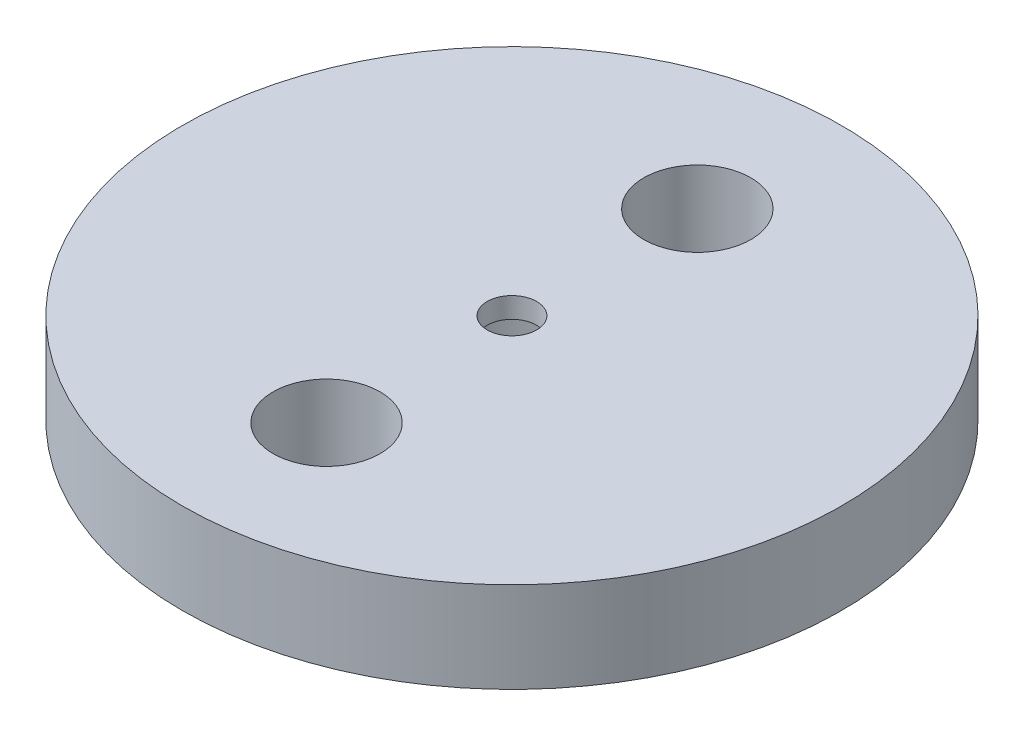
ISO-10303-21;
HEADER;
FILE_DESCRIPTION(('STEP AP214'),'2;1');
FILE_NAME('part.step','',(''),(''),'','','');
FILE_SCHEMA(('AUTOMOTIVE_DESIGN { 1 0 10303 214 1 1 1 1 }'));
ENDSEC;
DATA;
#1=APPLICATION_CONTEXT('core data for automotive mechanical design processes');
#2=APPLICATION_PROTOCOL_DEFINITION('international standard','automotive_design',2000,#1);
#3=PRODUCT_CONTEXT('',#1,'mechanical');
#4=PRODUCT('Part','Part','',(#3));
#5=PRODUCT_RELATED_PRODUCT_CATEGORY('part','',(#4));
#6=PRODUCT_DEFINITION_FORMATION('','',#4);
#7=PRODUCT_DEFINITION_CONTEXT('part definition',#1,'design');
#8=PRODUCT_DEFINITION('design','',#6,#7);
#9=PRODUCT_DEFINITION_SHAPE('','',#8);
#10=(LENGTH_UNIT() NAMED_UNIT(*) SI_UNIT(.MILLI.,.METRE.));
#11=(NAMED_UNIT(*) PLANE_ANGLE_UNIT() SI_UNIT($,.RADIAN.));
#12=(NAMED_UNIT(*) SI_UNIT($,.STERADIAN.) SOLID_ANGLE_UNIT());
#13=UNCERTAINTY_MEASURE_WITH_UNIT(LENGTH_MEASURE(1.E-05),#10,'distance_accuracy_value','');
#14=(GEOMETRIC_REPRESENTATION_CONTEXT(3) GLOBAL_UNCERTAINTY_ASSIGNED_CONTEXT((#13)) GLOBAL_UNIT_ASSIGNED_CONTEXT((#10,
#11,#12)) REPRESENTATION_CONTEXT('',''));
#15=CARTESIAN_POINT('',(0.,0.,0.));
#16=DIRECTION('',(0.,0.,1.));
#17=DIRECTION('',(1.,0.,0.));
#18=AXIS2_PLACEMENT_3D('',#15,#16,#17);
#19=CARTESIAN_POINT('',(0.,3.89705627484771,0.));
#20=DIRECTION('',(0.,-1.,0.));
#21=DIRECTION('',(0.,0.,-1.));
#22=AXIS2_PLACEMENT_3D('',#19,#20,#21);
#23=CYLINDRICAL_SURFACE('',#22,0.6);
#24=CARTESIAN_POINT('',(0.,2.2,0.));
#25=DIRECTION('',(0.,1.,0.));
#26=DIRECTION('',(0.,0.,1.));
#27=AXIS2_PLACEMENT_3D('',#24,#25,#26);
#28=CIRCLE('',#27,0.6);
#29=CARTESIAN_POINT('',(0.,2.2,0.6));
#30=VERTEX_POINT('',#29);
#31=EDGE_CURVE('E82',#30,#30,#28,.F.);
#32=ORIENTED_EDGE('',*,*,#31,.F.);
#33=EDGE_LOOP('',(#32));
#34=FACE_BOUND('',#33,.T.);
#35=CARTESIAN_POINT('',(0.,1.7,0.));
#36=DIRECTION('',(0.,-1.,0.));
#37=DIRECTION('',(0.,0.,-1.));
#38=AXIS2_PLACEMENT_3D('',#35,#36,#37);
#39=CIRCLE('',#38,0.6);
#40=CARTESIAN_POINT('',(0.,1.7,-0.6));
#41=VERTEX_POINT('',#40);
#42=EDGE_CURVE('E42',#41,#41,#39,.F.);
#43=ORIENTED_EDGE('',*,*,#42,.F.);
#44=EDGE_LOOP('',(#43));
#45=FACE_BOUND('',#44,.T.);
#46=ADVANCED_FACE('F38',(#34,#45),#23,.F.);
#47=CARTESIAN_POINT('',(0.,2.2,0.));
#48=DIRECTION('',(0.,-1.,0.));
#49=DIRECTION('',(0.,0.,-1.));
#50=AXIS2_PLACEMENT_3D('',#47,#48,#49);
#51=CYLINDRICAL_SURFACE('',#50,8.);
#52=CARTESIAN_POINT('',(0.,2.2,0.));
#53=DIRECTION('',(0.,1.,0.));
#54=DIRECTION('',(0.,0.,1.));
#55=AXIS2_PLACEMENT_3D('',#52,#53,#54);
#56=CIRCLE('',#55,8.);
#57=CARTESIAN_POINT('',(0.,2.2,8.));
#58=VERTEX_POINT('',#57);
#59=EDGE_CURVE('E47',#58,#58,#56,.T.);
#60=ORIENTED_EDGE('',*,*,#59,.F.);
#61=EDGE_LOOP('',(#60));
#62=FACE_BOUND('',#61,.T.);
#63=CARTESIAN_POINT('',(0.,0.,0.));
#64=DIRECTION('',(0.,1.,0.));
#65=DIRECTION('',(0.,0.,1.));
#66=AXIS2_PLACEMENT_3D('',#63,#64,#65);
#67=CIRCLE('',#66,8.);
#68=CARTESIAN_POINT('',(0.,0.,8.));
#69=VERTEX_POINT('',#68);
#70=EDGE_CURVE('E52',#69,#69,#67,.T.);
#71=ORIENTED_EDGE('',*,*,#70,.T.);
#72=EDGE_LOOP('',(#71));
#73=FACE_BOUND('',#72,.T.);
#74=ADVANCED_FACE('F40',(#62,#73),#51,.T.);
#75=CARTESIAN_POINT('',(0.,2.2,0.));
#76=DIRECTION('',(0.,1.,0.));
#77=DIRECTION('',(0.,0.,1.));
#78=AXIS2_PLACEMENT_3D('',#75,#76,#77);
#79=PLANE('',#78);
#80=ORIENTED_EDGE('',*,*,#31,.T.);
#81=EDGE_LOOP('',(#80));
#82=FACE_BOUND('',#81,.T.);
#83=CARTESIAN_POINT('',(0.,2.2,4.50000000000001));
#84=DIRECTION('',(0.,1.,0.));
#85=DIRECTION('',(0.,0.,-1.));
#86=AXIS2_PLACEMENT_3D('',#83,#84,#85);
#87=CIRCLE('',#86,1.3);
#88=CARTESIAN_POINT('',(0.,2.2,3.20000000000001));
#89=VERTEX_POINT('',#88);
#90=EDGE_CURVE('E68',#89,#89,#87,.T.);
#91=ORIENTED_EDGE('',*,*,#90,.F.);
#92=EDGE_LOOP('',(#91));
#93=FACE_BOUND('',#92,.T.);
#94=CARTESIAN_POINT('',(0.,2.2,-4.5));
#95=DIRECTION('',(0.,1.,0.));
#96=DIRECTION('',(0.,0.,1.));
#97=AXIS2_PLACEMENT_3D('',#94,#95,#96);
#98=CIRCLE('',#97,1.3);
#99=CARTESIAN_POINT('',(0.,2.2,-3.2));
#100=VERTEX_POINT('',#99);
#101=EDGE_CURVE('E59',#100,#100,#98,.T.);
#102=ORIENTED_EDGE('',*,*,#101,.F.);
#103=EDGE_LOOP('',(#102));
#104=FACE_BOUND('',#103,.T.);
#105=ORIENTED_EDGE('',*,*,#59,.T.);
#106=EDGE_LOOP('',(#105));
#107=FACE_BOUND('',#106,.T.);
#108=ADVANCED_FACE('F103',(#82,#93,#104,#107),#79,.T.);
#109=CARTESIAN_POINT('',(0.,0.,0.));
#110=DIRECTION('',(0.,1.,0.));
#111=DIRECTION('',(0.,0.,1.));
#112=AXIS2_PLACEMENT_3D('',#109,#110,#111);
#113=PLANE('',#112);
#114=CARTESIAN_POINT('',(0.,0.,0.));
#115=DIRECTION('',(0.,1.,0.));
#116=DIRECTION('',(0.,0.,1.));
#117=AXIS2_PLACEMENT_3D('',#114,#115,#116);
#118=CIRCLE('',#117,3.);
#119=CARTESIAN_POINT('',(0.,0.,3.));
#120=VERTEX_POINT('',#119);
#121=EDGE_CURVE('E10',#120,#120,#118,.F.);
#122=ORIENTED_EDGE('',*,*,#121,.F.);
#123=EDGE_LOOP('',(#122));
#124=FACE_BOUND('',#123,.T.);
#125=CARTESIAN_POINT('',(0.,0.,4.50000000000001));
#126=DIRECTION('',(0.,1.,0.));
#127=DIRECTION('',(0.,0.,-1.));
#128=AXIS2_PLACEMENT_3D('',#125,#126,#127);
#129=CIRCLE('',#128,1.3);
#130=CARTESIAN_POINT('',(0.,0.,3.20000000000001));
#131=VERTEX_POINT('',#130);
#132=EDGE_CURVE('E57',#131,#131,#129,.T.);
#133=ORIENTED_EDGE('',*,*,#132,.T.);
#134=EDGE_LOOP('',(#133));
#135=FACE_BOUND('',#134,.T.);
#136=CARTESIAN_POINT('',(0.,0.,-4.5));
#137=DIRECTION('',(0.,1.,0.));
#138=DIRECTION('',(0.,0.,1.));
#139=AXIS2_PLACEMENT_3D('',#136,#137,#138);
#140=CIRCLE('',#139,1.3);
#141=CARTESIAN_POINT('',(0.,0.,-3.2));
#142=VERTEX_POINT('',#141);
#143=EDGE_CURVE('E63',#142,#142,#140,.T.);
#144=ORIENTED_EDGE('',*,*,#143,.T.);
#145=EDGE_LOOP('',(#144));
#146=FACE_BOUND('',#145,.T.);
#147=ORIENTED_EDGE('',*,*,#70,.F.);
#148=EDGE_LOOP('',(#147));
#149=FACE_BOUND('',#148,.T.);
#150=ADVANCED_FACE('F127',(#124,#135,#146,#149),#113,.F.);
#151=CARTESIAN_POINT('',(0.,0.,-4.5));
#152=DIRECTION('',(0.,1.,0.));
#153=DIRECTION('',(0.,0.,1.));
#154=AXIS2_PLACEMENT_3D('',#151,#152,#153);
#155=CYLINDRICAL_SURFACE('',#154,1.3);
#156=ORIENTED_EDGE('',*,*,#143,.F.);
#157=EDGE_LOOP('',(#156));
#158=FACE_BOUND('',#157,.T.);
#159=ORIENTED_EDGE('',*,*,#101,.T.);
#160=EDGE_LOOP('',(#159));
#161=FACE_BOUND('',#160,.T.);
#162=ADVANCED_FACE('F123',(#158,#161),#155,.F.);
#163=CARTESIAN_POINT('',(0.,0.,4.50000000000001));
#164=DIRECTION('',(0.,1.,0.));
#165=DIRECTION('',(0.,0.,1.));
#166=AXIS2_PLACEMENT_3D('',#163,#164,#165);
#167=CYLINDRICAL_SURFACE('',#166,1.3);
#168=ORIENTED_EDGE('',*,*,#132,.F.);
#169=EDGE_LOOP('',(#168));
#170=FACE_BOUND('',#169,.T.);
#171=ORIENTED_EDGE('',*,*,#90,.T.);
#172=EDGE_LOOP('',(#171));
#173=FACE_BOUND('',#172,.T.);
#174=ADVANCED_FACE('F116',(#170,#173),#167,.F.);
#175=CARTESIAN_POINT('',(0.,-2.2,0.));
#176=DIRECTION('',(0.,-1.,0.));
#177=DIRECTION('',(0.,0.,-1.));
#178=AXIS2_PLACEMENT_3D('',#175,#176,#177);
#179=PLANE('',#178);
#180=CARTESIAN_POINT('',(0.,-2.2,0.));
#181=DIRECTION('',(0.,-1.,0.));
#182=DIRECTION('',(0.,0.,-1.));
#183=AXIS2_PLACEMENT_3D('',#180,#181,#182);
#184=CIRCLE('',#183,3.);
#185=CARTESIAN_POINT('',(0.,-2.2,-3.));
#186=VERTEX_POINT('',#185);
#187=EDGE_CURVE('E64',#186,#186,#184,.T.);
#188=ORIENTED_EDGE('',*,*,#187,.T.);
#189=EDGE_LOOP('',(#188));
#190=FACE_BOUND('',#189,.T.);
#191=CARTESIAN_POINT('',(0.,-2.2,0.));
#192=DIRECTION('',(0.,-1.,0.));
#193=DIRECTION('',(0.,0.,-1.));
#194=AXIS2_PLACEMENT_3D('',#191,#192,#193);
#195=CIRCLE('',#194,2.45);
#196=CARTESIAN_POINT('',(0.,-2.2,-2.45));
#197=VERTEX_POINT('',#196);
#198=EDGE_CURVE('E78',#197,#197,#195,.T.);
#199=ORIENTED_EDGE('',*,*,#198,.F.);
#200=EDGE_LOOP('',(#199));
#201=FACE_BOUND('',#200,.T.);
#202=ADVANCED_FACE('F113',(#190,#201),#179,.T.);
#203=CARTESIAN_POINT('',(0.,-2.2,0.));
#204=DIRECTION('',(0.,1.,0.));
#205=DIRECTION('',(0.,0.,1.));
#206=AXIS2_PLACEMENT_3D('',#203,#204,#205);
#207=CYLINDRICAL_SURFACE('',#206,3.);
#208=ORIENTED_EDGE('',*,*,#187,.F.);
#209=EDGE_LOOP('',(#208));
#210=FACE_BOUND('',#209,.T.);
#211=ORIENTED_EDGE('',*,*,#121,.T.);
#212=EDGE_LOOP('',(#211));
#213=FACE_BOUND('',#212,.T.);
#214=ADVANCED_FACE('F111',(#210,#213),#207,.T.);
#215=CARTESIAN_POINT('',(0.,-2.2,0.));
#216=DIRECTION('',(0.,1.,0.));
#217=DIRECTION('',(0.,0.,1.));
#218=AXIS2_PLACEMENT_3D('',#215,#216,#217);
#219=CYLINDRICAL_SURFACE('',#218,2.45);
#220=ORIENTED_EDGE('',*,*,#198,.T.);
#221=EDGE_LOOP('',(#220));
#222=FACE_BOUND('',#221,.T.);
#223=CARTESIAN_POINT('',(0.,1.7,0.));
#224=DIRECTION('',(0.,-1.,0.));
#225=DIRECTION('',(0.,0.,-1.));
#226=AXIS2_PLACEMENT_3D('',#223,#224,#225);
#227=CIRCLE('',#226,2.45);
#228=CARTESIAN_POINT('',(0.,1.7,-2.45));
#229=VERTEX_POINT('',#228);
#230=EDGE_CURVE('E86',#229,#229,#227,.T.);
#231=ORIENTED_EDGE('',*,*,#230,.F.);
#232=EDGE_LOOP('',(#231));
#233=FACE_BOUND('',#232,.T.);
#234=ADVANCED_FACE('F108',(#222,#233),#219,.F.);
#235=CARTESIAN_POINT('',(0.,1.7,0.));
#236=DIRECTION('',(0.,-1.,0.));
#237=DIRECTION('',(0.,0.,-1.));
#238=AXIS2_PLACEMENT_3D('',#235,#236,#237);
#239=PLANE('',#238);
#240=ORIENTED_EDGE('',*,*,#230,.T.);
#241=EDGE_LOOP('',(#240));
#242=FACE_BOUND('',#241,.T.);
#243=ORIENTED_EDGE('',*,*,#42,.T.);
#244=EDGE_LOOP('',(#243));
#245=FACE_BOUND('',#244,.T.);
#246=ADVANCED_FACE('F95',(#242,#245),#239,.T.);
#247=CLOSED_SHELL('',(#46,#74,#108,#150,#162,#174,#202,#214,#234,#246));
#248=MANIFOLD_SOLID_BREP('B2',#247);
#249=ADVANCED_BREP_SHAPE_REPRESENTATION('',(#18,#248),#14);
#250=SHAPE_DEFINITION_REPRESENTATION(#9,#249);
ENDSEC;
END-ISO-10303-21;
